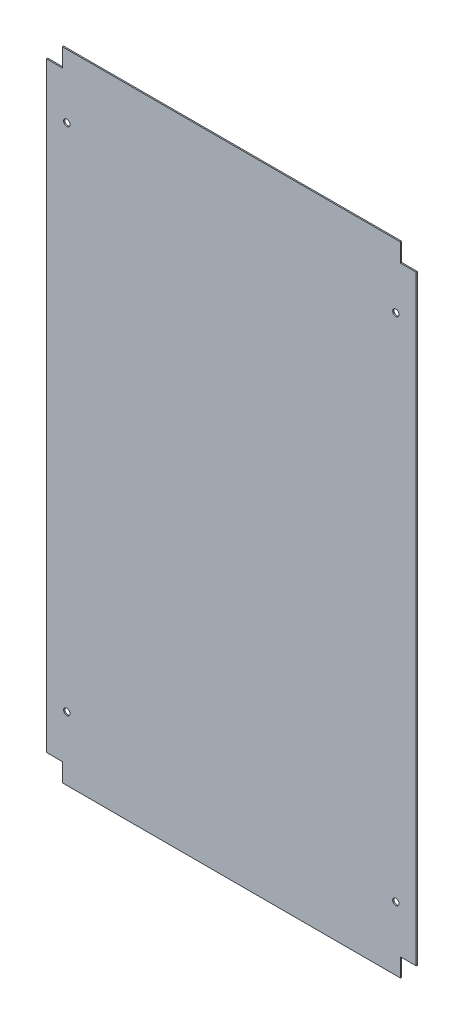
ISO-10303-21;
HEADER;
FILE_DESCRIPTION(('STEP AP214'),'2;1');
FILE_NAME('part.step','',(''),(''),'','','');
FILE_SCHEMA(('AUTOMOTIVE_DESIGN { 1 0 10303 214 1 1 1 1 }'));
ENDSEC;
DATA;
#1=APPLICATION_CONTEXT('core data for automotive mechanical design processes');
#2=APPLICATION_PROTOCOL_DEFINITION('international standard','automotive_design',2000,#1);
#3=PRODUCT_CONTEXT('',#1,'mechanical');
#4=PRODUCT('Part','Part','',(#3));
#5=PRODUCT_RELATED_PRODUCT_CATEGORY('part','',(#4));
#6=PRODUCT_DEFINITION_FORMATION('','',#4);
#7=PRODUCT_DEFINITION_CONTEXT('part definition',#1,'design');
#8=PRODUCT_DEFINITION('design','',#6,#7);
#9=PRODUCT_DEFINITION_SHAPE('','',#8);
#10=(LENGTH_UNIT() NAMED_UNIT(*) SI_UNIT(.MILLI.,.METRE.));
#11=(NAMED_UNIT(*) PLANE_ANGLE_UNIT() SI_UNIT($,.RADIAN.));
#12=(NAMED_UNIT(*) SI_UNIT($,.STERADIAN.) SOLID_ANGLE_UNIT());
#13=UNCERTAINTY_MEASURE_WITH_UNIT(LENGTH_MEASURE(1.E-05),#10,'distance_accuracy_value','');
#14=(GEOMETRIC_REPRESENTATION_CONTEXT(3) GLOBAL_UNCERTAINTY_ASSIGNED_CONTEXT((#13)) GLOBAL_UNIT_ASSIGNED_CONTEXT((#10,
#11,#12)) REPRESENTATION_CONTEXT('',''));
#15=CARTESIAN_POINT('',(0.,0.,0.));
#16=DIRECTION('',(0.,0.,1.));
#17=DIRECTION('',(1.,0.,0.));
#18=AXIS2_PLACEMENT_3D('',#15,#16,#17);
#19=CARTESIAN_POINT('',(0.,0.,-1.524));
#20=DIRECTION('',(0.,0.,-1.));
#21=DIRECTION('',(-1.,0.,0.));
#22=AXIS2_PLACEMENT_3D('',#19,#20,#21);
#23=PLANE('',#22);
#24=CARTESIAN_POINT('',(204.724,317.5,-1.524));
#25=DIRECTION('',(0.,0.,-1.));
#26=DIRECTION('',(-1.,0.,0.));
#27=AXIS2_PLACEMENT_3D('',#24,#25,#26);
#28=CIRCLE('',#27,3.9624);
#29=CARTESIAN_POINT('',(200.7616,317.5,-1.524));
#30=VERTEX_POINT('',#29);
#31=EDGE_CURVE('E383',#30,#30,#28,.T.);
#32=ORIENTED_EDGE('',*,*,#31,.F.);
#33=EDGE_LOOP('',(#32));
#34=FACE_BOUND('',#33,.T.);
#35=CARTESIAN_POINT('',(-204.851,-317.5,-1.524));
#36=DIRECTION('',(0.,0.,-1.));
#37=DIRECTION('',(-1.,0.,0.));
#38=AXIS2_PLACEMENT_3D('',#35,#36,#37);
#39=CIRCLE('',#38,3.9624);
#40=CARTESIAN_POINT('',(-208.8134,-317.5,-1.524));
#41=VERTEX_POINT('',#40);
#42=EDGE_CURVE('E379',#41,#41,#39,.T.);
#43=ORIENTED_EDGE('',*,*,#42,.F.);
#44=EDGE_LOOP('',(#43));
#45=FACE_BOUND('',#44,.T.);
#46=CARTESIAN_POINT('',(204.724,-317.5,-1.524));
#47=DIRECTION('',(0.,0.,-1.));
#48=DIRECTION('',(-1.,0.,0.));
#49=AXIS2_PLACEMENT_3D('',#46,#47,#48);
#50=CIRCLE('',#49,3.9624);
#51=CARTESIAN_POINT('',(200.7616,-317.5,-1.524));
#52=VERTEX_POINT('',#51);
#53=EDGE_CURVE('E375',#52,#52,#50,.T.);
#54=ORIENTED_EDGE('',*,*,#53,.F.);
#55=EDGE_LOOP('',(#54));
#56=FACE_BOUND('',#55,.T.);
#57=CARTESIAN_POINT('',(-204.851,317.5,-1.524));
#58=DIRECTION('',(0.,0.,-1.));
#59=DIRECTION('',(-1.,0.,0.));
#60=AXIS2_PLACEMENT_3D('',#57,#58,#59);
#61=CIRCLE('',#60,3.9624);
#62=CARTESIAN_POINT('',(-208.8134,317.5,-1.524));
#63=VERTEX_POINT('',#62);
#64=EDGE_CURVE('E371',#63,#63,#61,.T.);
#65=ORIENTED_EDGE('',*,*,#64,.F.);
#66=EDGE_LOOP('',(#65));
#67=FACE_BOUND('',#66,.T.);
#68=DIRECTION('',(0.,-1.,0.));
#69=VECTOR('',#68,1.);
#70=CARTESIAN_POINT('',(210.3628,-380.238,-1.524));
#71=LINE('',#70,#69);
#72=CARTESIAN_POINT('',(210.3628,-374.0404,-1.524));
#73=VERTEX_POINT('',#72);
#74=CARTESIAN_POINT('',(210.3628,-396.734962531012,-1.52399999999991));
#75=VERTEX_POINT('',#74);
#76=EDGE_CURVE('E462',#73,#75,#71,.T.);
#77=ORIENTED_EDGE('',*,*,#76,.T.);
#78=DIRECTION('',(-1.,0.,0.));
#79=VECTOR('',#78,1.);
#80=CARTESIAN_POINT('',(210.3628,-396.734962531012,-1.52399999999991));
#81=LINE('',#80,#79);
#82=CARTESIAN_POINT('',(-210.3628,-396.734962531012,-1.52399999999991));
#83=VERTEX_POINT('',#82);
#84=EDGE_CURVE('E328',#83,#75,#81,.F.);
#85=ORIENTED_EDGE('',*,*,#84,.F.);
#86=DIRECTION('',(0.,1.,0.));
#87=VECTOR('',#86,1.);
#88=CARTESIAN_POINT('',(-210.3628,-380.238,-1.524));
#89=LINE('',#88,#87);
#90=CARTESIAN_POINT('',(-210.3628,-374.0404,-1.524));
#91=VERTEX_POINT('',#90);
#92=EDGE_CURVE('E478',#83,#91,#89,.T.);
#93=ORIENTED_EDGE('',*,*,#92,.T.);
#94=DIRECTION('',(-1.,0.,0.));
#95=VECTOR('',#94,1.);
#96=CARTESIAN_POINT('',(-210.2866,-374.0404,-1.52400000000004));
#97=LINE('',#96,#95);
#98=CARTESIAN_POINT('',(-210.2866,-374.0404,-1.524));
#99=VERTEX_POINT('',#98);
#100=EDGE_CURVE('E401',#99,#91,#97,.T.);
#101=ORIENTED_EDGE('',*,*,#100,.F.);
#102=DIRECTION('',(0.,-1.,0.));
#103=VECTOR('',#102,1.);
#104=CARTESIAN_POINT('',(-210.2866,-373.888,-1.52400000000004));
#105=LINE('',#104,#103);
#106=CARTESIAN_POINT('',(-210.2866,-373.888,-1.524));
#107=VERTEX_POINT('',#106);
#108=EDGE_CURVE('E395',#107,#99,#105,.T.);
#109=ORIENTED_EDGE('',*,*,#108,.F.);
#110=DIRECTION('',(-1.,0.,0.));
#111=VECTOR('',#110,1.);
#112=CARTESIAN_POINT('',(-213.487,-373.888,-1.524));
#113=LINE('',#112,#111);
#114=CARTESIAN_POINT('',(-229.983962531013,-373.888,-1.52399999999989));
#115=VERTEX_POINT('',#114);
#116=EDGE_CURVE('E481',#107,#115,#113,.T.);
#117=ORIENTED_EDGE('',*,*,#116,.T.);
#118=DIRECTION('',(0.,1.,0.));
#119=VECTOR('',#118,1.);
#120=CARTESIAN_POINT('',(-229.983962531013,-373.888,-1.52399999999989));
#121=LINE('',#120,#119);
#122=CARTESIAN_POINT('',(-229.983962531013,373.888,-1.5239999999998));
#123=VERTEX_POINT('',#122);
#124=EDGE_CURVE('E311',#123,#115,#121,.F.);
#125=ORIENTED_EDGE('',*,*,#124,.F.);
#126=DIRECTION('',(1.,0.,0.));
#127=VECTOR('',#126,1.);
#128=CARTESIAN_POINT('',(-213.487,373.888,-1.524));
#129=LINE('',#128,#127);
#130=CARTESIAN_POINT('',(-210.2866,373.888,-1.524));
#131=VERTEX_POINT('',#130);
#132=EDGE_CURVE('E158',#123,#131,#129,.T.);
#133=ORIENTED_EDGE('',*,*,#132,.T.);
#134=DIRECTION('',(0.,-1.,0.));
#135=VECTOR('',#134,1.);
#136=CARTESIAN_POINT('',(-210.2866,374.0404,-1.52400000000004));
#137=LINE('',#136,#135);
#138=CARTESIAN_POINT('',(-210.2866,374.0404,-1.524));
#139=VERTEX_POINT('',#138);
#140=EDGE_CURVE('E153',#139,#131,#137,.T.);
#141=ORIENTED_EDGE('',*,*,#140,.F.);
#142=DIRECTION('',(1.,0.,0.));
#143=VECTOR('',#142,1.);
#144=CARTESIAN_POINT('',(-213.487,374.0404,-1.52400000000004));
#145=LINE('',#144,#143);
#146=CARTESIAN_POINT('',(-210.3628,374.0404,-1.524));
#147=VERTEX_POINT('',#146);
#148=EDGE_CURVE('E388',#147,#139,#145,.T.);
#149=ORIENTED_EDGE('',*,*,#148,.F.);
#150=DIRECTION('',(0.,1.,0.));
#151=VECTOR('',#150,1.);
#152=CARTESIAN_POINT('',(-210.3628,380.238,-1.524));
#153=LINE('',#152,#151);
#154=CARTESIAN_POINT('',(-210.3628,396.734962531012,-1.52399999999986));
#155=VERTEX_POINT('',#154);
#156=EDGE_CURVE('E290',#147,#155,#153,.T.);
#157=ORIENTED_EDGE('',*,*,#156,.T.);
#158=DIRECTION('',(1.,0.,0.));
#159=VECTOR('',#158,1.);
#160=CARTESIAN_POINT('',(-210.3628,396.734962531012,-1.52399999999986));
#161=LINE('',#160,#159);
#162=CARTESIAN_POINT('',(210.3628,396.734962531012,-1.52399999999986));
#163=VERTEX_POINT('',#162);
#164=EDGE_CURVE('E288',#163,#155,#161,.F.);
#165=ORIENTED_EDGE('',*,*,#164,.F.);
#166=DIRECTION('',(0.,-1.,0.));
#167=VECTOR('',#166,1.);
#168=CARTESIAN_POINT('',(210.3628,380.238,-1.524));
#169=LINE('',#168,#167);
#170=CARTESIAN_POINT('',(210.3628,374.0404,-1.52400000000006));
#171=VERTEX_POINT('',#170);
#172=EDGE_CURVE('E275',#163,#171,#169,.T.);
#173=ORIENTED_EDGE('',*,*,#172,.T.);
#174=DIRECTION('',(1.,0.,0.));
#175=VECTOR('',#174,1.);
#176=CARTESIAN_POINT('',(210.2866,374.0404,-1.52400000000006));
#177=LINE('',#176,#175);
#178=CARTESIAN_POINT('',(210.2866,374.0404,-1.52400000000006));
#179=VERTEX_POINT('',#178);
#180=EDGE_CURVE('E441',#179,#171,#177,.T.);
#181=ORIENTED_EDGE('',*,*,#180,.F.);
#182=DIRECTION('',(0.,1.,0.));
#183=VECTOR('',#182,1.);
#184=CARTESIAN_POINT('',(210.2866,373.888,-1.52400000000006));
#185=LINE('',#184,#183);
#186=CARTESIAN_POINT('',(210.2866,373.888,-1.52400000000006));
#187=VERTEX_POINT('',#186);
#188=EDGE_CURVE('E435',#187,#179,#185,.T.);
#189=ORIENTED_EDGE('',*,*,#188,.F.);
#190=DIRECTION('',(1.,0.,0.));
#191=VECTOR('',#190,1.);
#192=CARTESIAN_POINT('',(213.487,373.888,-1.524));
#193=LINE('',#192,#191);
#194=CARTESIAN_POINT('',(229.983962531012,373.888,-1.52399999999986));
#195=VERTEX_POINT('',#194);
#196=EDGE_CURVE('E284',#187,#195,#193,.T.);
#197=ORIENTED_EDGE('',*,*,#196,.T.);
#198=DIRECTION('',(0.,-1.,0.));
#199=VECTOR('',#198,1.);
#200=CARTESIAN_POINT('',(229.983962531012,373.888,-1.52399999999986));
#201=LINE('',#200,#199);
#202=CARTESIAN_POINT('',(229.983962531012,-373.888,-1.52399999999978));
#203=VERTEX_POINT('',#202);
#204=EDGE_CURVE('E320',#203,#195,#201,.F.);
#205=ORIENTED_EDGE('',*,*,#204,.F.);
#206=DIRECTION('',(-1.,0.,0.));
#207=VECTOR('',#206,1.);
#208=CARTESIAN_POINT('',(213.487,-373.888,-1.524));
#209=LINE('',#208,#207);
#210=CARTESIAN_POINT('',(210.2866,-373.888,-1.524));
#211=VERTEX_POINT('',#210);
#212=EDGE_CURVE('E490',#203,#211,#209,.T.);
#213=ORIENTED_EDGE('',*,*,#212,.T.);
#214=DIRECTION('',(0.,1.,0.));
#215=VECTOR('',#214,1.);
#216=CARTESIAN_POINT('',(210.2866,-374.0404,-1.52400000000006));
#217=LINE('',#216,#215);
#218=CARTESIAN_POINT('',(210.2866,-374.0404,-1.524));
#219=VERTEX_POINT('',#218);
#220=EDGE_CURVE('E430',#219,#211,#217,.T.);
#221=ORIENTED_EDGE('',*,*,#220,.F.);
#222=DIRECTION('',(-1.,0.,0.));
#223=VECTOR('',#222,1.);
#224=CARTESIAN_POINT('',(213.487,-374.0404,-1.52400000000006));
#225=LINE('',#224,#223);
#226=EDGE_CURVE('E425',#73,#219,#225,.T.);
#227=ORIENTED_EDGE('',*,*,#226,.F.);
#228=EDGE_LOOP('',(#77,#85,#93,#101,#109,#117,#125,#133,#141,#149,#157,#165,#173,#181,#189,#197,
#205,#213,#221,#227));
#229=FACE_BOUND('',#228,.T.);
#230=ADVANCED_FACE('F137',(#34,#45,#56,#67,#229),#23,.T.);
#231=CARTESIAN_POINT('',(0.,0.,0.));
#232=DIRECTION('',(0.,0.,-1.));
#233=DIRECTION('',(-1.,0.,0.));
#234=AXIS2_PLACEMENT_3D('',#231,#232,#233);
#235=PLANE('',#234);
#236=CARTESIAN_POINT('',(204.724,317.5,0.));
#237=DIRECTION('',(0.,0.,1.));
#238=DIRECTION('',(1.,0.,0.));
#239=AXIS2_PLACEMENT_3D('',#236,#237,#238);
#240=CIRCLE('',#239,3.9624);
#241=CARTESIAN_POINT('',(208.6864,317.5,0.));
#242=VERTEX_POINT('',#241);
#243=EDGE_CURVE('E360',#242,#242,#240,.T.);
#244=ORIENTED_EDGE('',*,*,#243,.F.);
#245=EDGE_LOOP('',(#244));
#246=FACE_BOUND('',#245,.T.);
#247=CARTESIAN_POINT('',(-204.851,-317.5,0.));
#248=DIRECTION('',(0.,0.,1.));
#249=DIRECTION('',(1.,0.,0.));
#250=AXIS2_PLACEMENT_3D('',#247,#248,#249);
#251=CIRCLE('',#250,3.9624);
#252=CARTESIAN_POINT('',(-200.8886,-317.5,0.));
#253=VERTEX_POINT('',#252);
#254=EDGE_CURVE('E359',#253,#253,#251,.T.);
#255=ORIENTED_EDGE('',*,*,#254,.F.);
#256=EDGE_LOOP('',(#255));
#257=FACE_BOUND('',#256,.T.);
#258=CARTESIAN_POINT('',(204.724,-317.5,0.));
#259=DIRECTION('',(0.,0.,1.));
#260=DIRECTION('',(1.,0.,0.));
#261=AXIS2_PLACEMENT_3D('',#258,#259,#260);
#262=CIRCLE('',#261,3.9624);
#263=CARTESIAN_POINT('',(208.6864,-317.5,0.));
#264=VERTEX_POINT('',#263);
#265=EDGE_CURVE('E344',#264,#264,#262,.T.);
#266=ORIENTED_EDGE('',*,*,#265,.F.);
#267=EDGE_LOOP('',(#266));
#268=FACE_BOUND('',#267,.T.);
#269=CARTESIAN_POINT('',(-204.851,317.5,0.));
#270=DIRECTION('',(0.,0.,1.));
#271=DIRECTION('',(1.,0.,0.));
#272=AXIS2_PLACEMENT_3D('',#269,#270,#271);
#273=CIRCLE('',#272,3.9624);
#274=CARTESIAN_POINT('',(-200.8886,317.5,0.));
#275=VERTEX_POINT('',#274);
#276=EDGE_CURVE('E364',#275,#275,#273,.T.);
#277=ORIENTED_EDGE('',*,*,#276,.F.);
#278=EDGE_LOOP('',(#277));
#279=FACE_BOUND('',#278,.T.);
#280=DIRECTION('',(0.,1.,0.));
#281=VECTOR('',#280,1.);
#282=CARTESIAN_POINT('',(-210.3628,-380.238,0.));
#283=LINE('',#282,#281);
#284=CARTESIAN_POINT('',(-210.3628,-396.734962531012,1.11022302462516E-13));
#285=VERTEX_POINT('',#284);
#286=CARTESIAN_POINT('',(-210.3628,-374.0404,0.));
#287=VERTEX_POINT('',#286);
#288=EDGE_CURVE('E472',#285,#287,#283,.T.);
#289=ORIENTED_EDGE('',*,*,#288,.F.);
#290=DIRECTION('',(1.,0.,0.));
#291=VECTOR('',#290,1.);
#292=CARTESIAN_POINT('',(0.,-396.734962531012,1.11022302462516E-13));
#293=LINE('',#292,#291);
#294=CARTESIAN_POINT('',(210.3628,-396.734962531012,1.11022302462516E-13));
#295=VERTEX_POINT('',#294);
#296=EDGE_CURVE('E340',#285,#295,#293,.T.);
#297=ORIENTED_EDGE('',*,*,#296,.T.);
#298=DIRECTION('',(0.,-1.,0.));
#299=VECTOR('',#298,1.);
#300=CARTESIAN_POINT('',(210.3628,-380.238,0.));
#301=LINE('',#300,#299);
#302=CARTESIAN_POINT('',(210.3628,-374.0404,0.));
#303=VERTEX_POINT('',#302);
#304=EDGE_CURVE('E487',#303,#295,#301,.T.);
#305=ORIENTED_EDGE('',*,*,#304,.F.);
#306=DIRECTION('',(1.,0.,0.));
#307=VECTOR('',#306,1.);
#308=CARTESIAN_POINT('',(0.,-374.0404,0.));
#309=LINE('',#308,#307);
#310=CARTESIAN_POINT('',(210.2866,-374.0404,0.));
#311=VERTEX_POINT('',#310);
#312=EDGE_CURVE('E429',#311,#303,#309,.T.);
#313=ORIENTED_EDGE('',*,*,#312,.F.);
#314=DIRECTION('',(0.,-1.,0.));
#315=VECTOR('',#314,1.);
#316=CARTESIAN_POINT('',(210.2866,0.,0.));
#317=LINE('',#316,#315);
#318=CARTESIAN_POINT('',(210.2866,-373.888,0.));
#319=VERTEX_POINT('',#318);
#320=EDGE_CURVE('E513',#319,#311,#317,.T.);
#321=ORIENTED_EDGE('',*,*,#320,.F.);
#322=DIRECTION('',(-1.,0.,0.));
#323=VECTOR('',#322,1.);
#324=CARTESIAN_POINT('',(213.487,-373.888,0.));
#325=LINE('',#324,#323);
#326=CARTESIAN_POINT('',(229.983962531012,-373.888,1.94289029309402E-13));
#327=VERTEX_POINT('',#326);
#328=EDGE_CURVE('E484',#327,#319,#325,.T.);
#329=ORIENTED_EDGE('',*,*,#328,.F.);
#330=DIRECTION('',(0.,1.,0.));
#331=VECTOR('',#330,1.);
#332=CARTESIAN_POINT('',(229.983962531012,0.,1.66533453693773E-13));
#333=LINE('',#332,#331);
#334=CARTESIAN_POINT('',(229.983962531012,373.888,1.11022302462516E-13));
#335=VERTEX_POINT('',#334);
#336=EDGE_CURVE('E307',#327,#335,#333,.T.);
#337=ORIENTED_EDGE('',*,*,#336,.T.);
#338=DIRECTION('',(1.,0.,0.));
#339=VECTOR('',#338,1.);
#340=CARTESIAN_POINT('',(213.487,373.888,0.));
#341=LINE('',#340,#339);
#342=CARTESIAN_POINT('',(210.2866,373.888,0.));
#343=VERTEX_POINT('',#342);
#344=EDGE_CURVE('E285',#343,#335,#341,.T.);
#345=ORIENTED_EDGE('',*,*,#344,.F.);
#346=DIRECTION('',(0.,-1.,0.));
#347=VECTOR('',#346,1.);
#348=CARTESIAN_POINT('',(210.2866,0.,0.));
#349=LINE('',#348,#347);
#350=CARTESIAN_POINT('',(210.2866,374.0404,0.));
#351=VERTEX_POINT('',#350);
#352=EDGE_CURVE('E509',#351,#343,#349,.T.);
#353=ORIENTED_EDGE('',*,*,#352,.F.);
#354=DIRECTION('',(-1.,0.,0.));
#355=VECTOR('',#354,1.);
#356=CARTESIAN_POINT('',(0.,374.0404,0.));
#357=LINE('',#356,#355);
#358=CARTESIAN_POINT('',(210.3628,374.0404,0.));
#359=VERTEX_POINT('',#358);
#360=EDGE_CURVE('E459',#359,#351,#357,.T.);
#361=ORIENTED_EDGE('',*,*,#360,.F.);
#362=DIRECTION('',(0.,-1.,0.));
#363=VECTOR('',#362,1.);
#364=CARTESIAN_POINT('',(210.3628,380.238,0.));
#365=LINE('',#364,#363);
#366=CARTESIAN_POINT('',(210.3628,396.734962531012,1.66533453693773E-13));
#367=VERTEX_POINT('',#366);
#368=EDGE_CURVE('E469',#367,#359,#365,.T.);
#369=ORIENTED_EDGE('',*,*,#368,.F.);
#370=DIRECTION('',(-1.,0.,0.));
#371=VECTOR('',#370,1.);
#372=CARTESIAN_POINT('',(0.,396.734962531012,1.66533453693773E-13));
#373=LINE('',#372,#371);
#374=CARTESIAN_POINT('',(-210.3628,396.734962531012,1.66533453693773E-13));
#375=VERTEX_POINT('',#374);
#376=EDGE_CURVE('E299',#367,#375,#373,.T.);
#377=ORIENTED_EDGE('',*,*,#376,.T.);
#378=DIRECTION('',(0.,1.,0.));
#379=VECTOR('',#378,1.);
#380=CARTESIAN_POINT('',(-210.3628,380.238,0.));
#381=LINE('',#380,#379);
#382=CARTESIAN_POINT('',(-210.3628,374.0404,0.));
#383=VERTEX_POINT('',#382);
#384=EDGE_CURVE('E463',#383,#375,#381,.T.);
#385=ORIENTED_EDGE('',*,*,#384,.F.);
#386=DIRECTION('',(-1.,0.,0.));
#387=VECTOR('',#386,1.);
#388=CARTESIAN_POINT('',(0.,374.0404,0.));
#389=LINE('',#388,#387);
#390=CARTESIAN_POINT('',(-210.2866,374.0404,0.));
#391=VERTEX_POINT('',#390);
#392=EDGE_CURVE('E420',#391,#383,#389,.T.);
#393=ORIENTED_EDGE('',*,*,#392,.F.);
#394=DIRECTION('',(0.,1.,0.));
#395=VECTOR('',#394,1.);
#396=CARTESIAN_POINT('',(-210.2866,0.,0.));
#397=LINE('',#396,#395);
#398=CARTESIAN_POINT('',(-210.2866,373.888,0.));
#399=VERTEX_POINT('',#398);
#400=EDGE_CURVE('E13',#399,#391,#397,.T.);
#401=ORIENTED_EDGE('',*,*,#400,.F.);
#402=DIRECTION('',(1.,0.,0.));
#403=VECTOR('',#402,1.);
#404=CARTESIAN_POINT('',(-213.487,373.888,0.));
#405=LINE('',#404,#403);
#406=CARTESIAN_POINT('',(-229.983962531013,373.888,1.66533453693773E-13));
#407=VERTEX_POINT('',#406);
#408=EDGE_CURVE('E466',#407,#399,#405,.T.);
#409=ORIENTED_EDGE('',*,*,#408,.F.);
#410=DIRECTION('',(0.,-1.,0.));
#411=VECTOR('',#410,1.);
#412=CARTESIAN_POINT('',(-229.983962531013,0.,1.38777878078145E-13));
#413=LINE('',#412,#411);
#414=CARTESIAN_POINT('',(-229.983962531013,-373.888,1.11022302462516E-13));
#415=VERTEX_POINT('',#414);
#416=EDGE_CURVE('E324',#407,#415,#413,.T.);
#417=ORIENTED_EDGE('',*,*,#416,.T.);
#418=DIRECTION('',(-1.,0.,0.));
#419=VECTOR('',#418,1.);
#420=CARTESIAN_POINT('',(-213.487,-373.888,0.));
#421=LINE('',#420,#419);
#422=CARTESIAN_POINT('',(-210.2866,-373.888,0.));
#423=VERTEX_POINT('',#422);
#424=EDGE_CURVE('E475',#423,#415,#421,.T.);
#425=ORIENTED_EDGE('',*,*,#424,.F.);
#426=DIRECTION('',(0.,1.,0.));
#427=VECTOR('',#426,1.);
#428=CARTESIAN_POINT('',(-210.2866,0.,0.));
#429=LINE('',#428,#427);
#430=CARTESIAN_POINT('',(-210.2866,-374.0404,0.));
#431=VERTEX_POINT('',#430);
#432=EDGE_CURVE('E146',#431,#423,#429,.T.);
#433=ORIENTED_EDGE('',*,*,#432,.F.);
#434=DIRECTION('',(1.,0.,0.));
#435=VECTOR('',#434,1.);
#436=CARTESIAN_POINT('',(0.,-374.0404,0.));
#437=LINE('',#436,#435);
#438=EDGE_CURVE('E391',#287,#431,#437,.T.);
#439=ORIENTED_EDGE('',*,*,#438,.F.);
#440=EDGE_LOOP('',(#289,#297,#305,#313,#321,#329,#337,#345,#353,#361,#369,#377,#385,#393,#401,
#409,#417,#425,#433,#439));
#441=FACE_BOUND('',#440,.T.);
#442=ADVANCED_FACE('F139',(#246,#257,#268,#279,#441),#235,.F.);
#443=CARTESIAN_POINT('',(-210.3628,-380.238,-1.524));
#444=DIRECTION('',(1.,0.,0.));
#445=DIRECTION('',(0.,0.,-1.));
#446=AXIS2_PLACEMENT_3D('',#443,#444,#445);
#447=PLANE('',#446);
#448=ORIENTED_EDGE('',*,*,#92,.F.);
#449=DIRECTION('',(0.,0.,-1.));
#450=VECTOR('',#449,1.);
#451=CARTESIAN_POINT('',(-210.3628,-396.734962531012,1.11022302462516E-13));
#452=LINE('',#451,#450);
#453=EDGE_CURVE('E349',#285,#83,#452,.T.);
#454=ORIENTED_EDGE('',*,*,#453,.F.);
#455=ORIENTED_EDGE('',*,*,#288,.T.);
#456=DIRECTION('',(0.,0.,1.));
#457=VECTOR('',#456,1.);
#458=CARTESIAN_POINT('',(-210.3628,-374.0404,-1.524));
#459=LINE('',#458,#457);
#460=EDGE_CURVE('E517',#91,#287,#459,.T.);
#461=ORIENTED_EDGE('',*,*,#460,.F.);
#462=EDGE_LOOP('',(#448,#454,#455,#461));
#463=FACE_BOUND('',#462,.T.);
#464=ADVANCED_FACE('F547',(#463),#447,.F.);
#465=CARTESIAN_POINT('',(210.3628,-380.238,-1.524));
#466=DIRECTION('',(-1.,0.,0.));
#467=DIRECTION('',(0.,-1.,0.));
#468=AXIS2_PLACEMENT_3D('',#465,#466,#467);
#469=PLANE('',#468);
#470=ORIENTED_EDGE('',*,*,#304,.T.);
#471=DIRECTION('',(0.,0.,-1.));
#472=VECTOR('',#471,1.);
#473=CARTESIAN_POINT('',(210.3628,-396.734962531012,1.11022302462516E-13));
#474=LINE('',#473,#472);
#475=EDGE_CURVE('E345',#295,#75,#474,.T.);
#476=ORIENTED_EDGE('',*,*,#475,.T.);
#477=ORIENTED_EDGE('',*,*,#76,.F.);
#478=DIRECTION('',(0.,0.,-1.));
#479=VECTOR('',#478,1.);
#480=CARTESIAN_POINT('',(210.3628,-374.0404,-1.524));
#481=LINE('',#480,#479);
#482=EDGE_CURVE('E499',#303,#73,#481,.T.);
#483=ORIENTED_EDGE('',*,*,#482,.F.);
#484=EDGE_LOOP('',(#470,#476,#477,#483));
#485=FACE_BOUND('',#484,.T.);
#486=ADVANCED_FACE('F550',(#485),#469,.F.);
#487=CARTESIAN_POINT('',(-210.3628,380.238,-1.524));
#488=DIRECTION('',(1.,0.,0.));
#489=DIRECTION('',(0.,0.,-1.));
#490=AXIS2_PLACEMENT_3D('',#487,#488,#489);
#491=PLANE('',#490);
#492=DIRECTION('',(0.,0.,-1.));
#493=VECTOR('',#492,1.);
#494=CARTESIAN_POINT('',(-210.3628,374.0404,-1.524));
#495=LINE('',#494,#493);
#496=EDGE_CURVE('E521',#383,#147,#495,.T.);
#497=ORIENTED_EDGE('',*,*,#496,.F.);
#498=ORIENTED_EDGE('',*,*,#384,.T.);
#499=DIRECTION('',(0.,0.,-1.));
#500=VECTOR('',#499,1.);
#501=CARTESIAN_POINT('',(-210.3628,396.734962531012,1.11022302462516E-13));
#502=LINE('',#501,#500);
#503=EDGE_CURVE('E301',#375,#155,#502,.T.);
#504=ORIENTED_EDGE('',*,*,#503,.T.);
#505=ORIENTED_EDGE('',*,*,#156,.F.);
#506=EDGE_LOOP('',(#497,#498,#504,#505));
#507=FACE_BOUND('',#506,.T.);
#508=ADVANCED_FACE('F579',(#507),#491,.F.);
#509=CARTESIAN_POINT('',(-213.487,373.888,-1.524));
#510=DIRECTION('',(0.,-1.,0.));
#511=DIRECTION('',(1.,0.,0.));
#512=AXIS2_PLACEMENT_3D('',#509,#510,#511);
#513=PLANE('',#512);
#514=ORIENTED_EDGE('',*,*,#132,.F.);
#515=DIRECTION('',(0.,0.,-1.));
#516=VECTOR('',#515,1.);
#517=CARTESIAN_POINT('',(-229.983962531013,373.888,1.94289029309402E-13));
#518=LINE('',#517,#516);
#519=EDGE_CURVE('E333',#407,#123,#518,.T.);
#520=ORIENTED_EDGE('',*,*,#519,.F.);
#521=ORIENTED_EDGE('',*,*,#408,.T.);
#522=DIRECTION('',(0.,0.,1.));
#523=VECTOR('',#522,1.);
#524=CARTESIAN_POINT('',(-210.2866,373.888,-1.52400000000004));
#525=LINE('',#524,#523);
#526=EDGE_CURVE('E399',#131,#399,#525,.T.);
#527=ORIENTED_EDGE('',*,*,#526,.F.);
#528=EDGE_LOOP('',(#514,#520,#521,#527));
#529=FACE_BOUND('',#528,.T.);
#530=ADVANCED_FACE('F587',(#529),#513,.F.);
#531=CARTESIAN_POINT('',(-213.487,-373.888,-1.524));
#532=DIRECTION('',(0.,1.,0.));
#533=DIRECTION('',(-1.,0.,0.));
#534=AXIS2_PLACEMENT_3D('',#531,#532,#533);
#535=PLANE('',#534);
#536=ORIENTED_EDGE('',*,*,#424,.T.);
#537=DIRECTION('',(0.,0.,-1.));
#538=VECTOR('',#537,1.);
#539=CARTESIAN_POINT('',(-229.983962531013,-373.888,1.11022302462516E-13));
#540=LINE('',#539,#538);
#541=EDGE_CURVE('E329',#415,#115,#540,.T.);
#542=ORIENTED_EDGE('',*,*,#541,.T.);
#543=ORIENTED_EDGE('',*,*,#116,.F.);
#544=DIRECTION('',(0.,0.,1.));
#545=VECTOR('',#544,1.);
#546=CARTESIAN_POINT('',(-210.2866,-373.888,-1.52400000000004));
#547=LINE('',#546,#545);
#548=EDGE_CURVE('E400',#107,#423,#547,.T.);
#549=ORIENTED_EDGE('',*,*,#548,.T.);
#550=EDGE_LOOP('',(#536,#542,#543,#549));
#551=FACE_BOUND('',#550,.T.);
#552=ADVANCED_FACE('F533',(#551),#535,.F.);
#553=CARTESIAN_POINT('',(210.3628,380.238,-1.524));
#554=DIRECTION('',(-1.,0.,0.));
#555=DIRECTION('',(0.,0.,1.));
#556=AXIS2_PLACEMENT_3D('',#553,#554,#555);
#557=PLANE('',#556);
#558=DIRECTION('',(0.,0.,1.));
#559=VECTOR('',#558,1.);
#560=CARTESIAN_POINT('',(210.3628,374.0404,-1.524));
#561=LINE('',#560,#559);
#562=EDGE_CURVE('E281',#171,#359,#561,.T.);
#563=ORIENTED_EDGE('',*,*,#562,.F.);
#564=ORIENTED_EDGE('',*,*,#172,.F.);
#565=DIRECTION('',(0.,0.,-1.));
#566=VECTOR('',#565,1.);
#567=CARTESIAN_POINT('',(210.3628,396.734962531012,1.66533453693773E-13));
#568=LINE('',#567,#566);
#569=EDGE_CURVE('E280',#367,#163,#568,.T.);
#570=ORIENTED_EDGE('',*,*,#569,.F.);
#571=ORIENTED_EDGE('',*,*,#368,.T.);
#572=EDGE_LOOP('',(#563,#564,#570,#571));
#573=FACE_BOUND('',#572,.T.);
#574=ADVANCED_FACE('F277',(#573),#557,.F.);
#575=CARTESIAN_POINT('',(213.487,373.888,-1.524));
#576=DIRECTION('',(0.,-1.,0.));
#577=DIRECTION('',(1.,0.,0.));
#578=AXIS2_PLACEMENT_3D('',#575,#576,#577);
#579=PLANE('',#578);
#580=ORIENTED_EDGE('',*,*,#344,.T.);
#581=DIRECTION('',(0.,0.,-1.));
#582=VECTOR('',#581,1.);
#583=CARTESIAN_POINT('',(229.983962531012,373.888,0.));
#584=LINE('',#583,#582);
#585=EDGE_CURVE('E312',#335,#195,#584,.T.);
#586=ORIENTED_EDGE('',*,*,#585,.T.);
#587=ORIENTED_EDGE('',*,*,#196,.F.);
#588=DIRECTION('',(0.,0.,1.));
#589=VECTOR('',#588,1.);
#590=CARTESIAN_POINT('',(210.2866,373.888,-1.52400000000006));
#591=LINE('',#590,#589);
#592=EDGE_CURVE('E440',#187,#343,#591,.T.);
#593=ORIENTED_EDGE('',*,*,#592,.T.);
#594=EDGE_LOOP('',(#580,#586,#587,#593));
#595=FACE_BOUND('',#594,.T.);
#596=ADVANCED_FACE('F568',(#595),#579,.F.);
#597=CARTESIAN_POINT('',(213.487,-373.888,-1.524));
#598=DIRECTION('',(0.,1.,0.));
#599=DIRECTION('',(-1.,0.,0.));
#600=AXIS2_PLACEMENT_3D('',#597,#598,#599);
#601=PLANE('',#600);
#602=ORIENTED_EDGE('',*,*,#212,.F.);
#603=DIRECTION('',(0.,0.,-1.));
#604=VECTOR('',#603,1.);
#605=CARTESIAN_POINT('',(229.983962531012,-373.888,1.94289029309402E-13));
#606=LINE('',#605,#604);
#607=EDGE_CURVE('E316',#327,#203,#606,.T.);
#608=ORIENTED_EDGE('',*,*,#607,.F.);
#609=ORIENTED_EDGE('',*,*,#328,.T.);
#610=DIRECTION('',(0.,0.,1.));
#611=VECTOR('',#610,1.);
#612=CARTESIAN_POINT('',(210.2866,-373.888,-1.52400000000006));
#613=LINE('',#612,#611);
#614=EDGE_CURVE('E439',#211,#319,#613,.T.);
#615=ORIENTED_EDGE('',*,*,#614,.F.);
#616=EDGE_LOOP('',(#602,#608,#609,#615));
#617=FACE_BOUND('',#616,.T.);
#618=ADVANCED_FACE('F564',(#617),#601,.F.);
#619=CARTESIAN_POINT('',(213.487,-374.0404,-1.52400000000006));
#620=DIRECTION('',(0.,1.,0.));
#621=DIRECTION('',(0.,0.,1.));
#622=AXIS2_PLACEMENT_3D('',#619,#620,#621);
#623=PLANE('',#622);
#624=DIRECTION('',(0.,0.,1.));
#625=VECTOR('',#624,1.);
#626=CARTESIAN_POINT('',(210.2866,-374.0404,-1.52400000000006));
#627=LINE('',#626,#625);
#628=EDGE_CURVE('E434',#219,#311,#627,.T.);
#629=ORIENTED_EDGE('',*,*,#628,.T.);
#630=ORIENTED_EDGE('',*,*,#312,.T.);
#631=ORIENTED_EDGE('',*,*,#482,.T.);
#632=ORIENTED_EDGE('',*,*,#226,.T.);
#633=EDGE_LOOP('',(#629,#630,#631,#632));
#634=FACE_BOUND('',#633,.T.);
#635=ADVANCED_FACE('F553',(#634),#623,.T.);
#636=CARTESIAN_POINT('',(210.2866,-374.0404,-1.52400000000006));
#637=DIRECTION('',(1.,0.,0.));
#638=DIRECTION('',(0.,0.,-1.));
#639=AXIS2_PLACEMENT_3D('',#636,#637,#638);
#640=PLANE('',#639);
#641=ORIENTED_EDGE('',*,*,#614,.T.);
#642=ORIENTED_EDGE('',*,*,#320,.T.);
#643=ORIENTED_EDGE('',*,*,#628,.F.);
#644=ORIENTED_EDGE('',*,*,#220,.T.);
#645=EDGE_LOOP('',(#641,#642,#643,#644));
#646=FACE_BOUND('',#645,.T.);
#647=ADVANCED_FACE('F556',(#646),#640,.T.);
#648=CARTESIAN_POINT('',(210.2866,373.888,-1.52400000000006));
#649=DIRECTION('',(1.,0.,0.));
#650=DIRECTION('',(0.,0.,-1.));
#651=AXIS2_PLACEMENT_3D('',#648,#649,#650);
#652=PLANE('',#651);
#653=DIRECTION('',(0.,0.,1.));
#654=VECTOR('',#653,1.);
#655=CARTESIAN_POINT('',(210.2866,374.0404,-1.52400000000006));
#656=LINE('',#655,#654);
#657=EDGE_CURVE('E424',#179,#351,#656,.T.);
#658=ORIENTED_EDGE('',*,*,#657,.T.);
#659=ORIENTED_EDGE('',*,*,#352,.T.);
#660=ORIENTED_EDGE('',*,*,#592,.F.);
#661=ORIENTED_EDGE('',*,*,#188,.T.);
#662=EDGE_LOOP('',(#658,#659,#660,#661));
#663=FACE_BOUND('',#662,.T.);
#664=ADVANCED_FACE('F573',(#663),#652,.T.);
#665=CARTESIAN_POINT('',(210.2866,374.0404,-1.52400000000006));
#666=DIRECTION('',(0.,-1.,0.));
#667=DIRECTION('',(0.,0.,-1.));
#668=AXIS2_PLACEMENT_3D('',#665,#666,#667);
#669=PLANE('',#668);
#670=ORIENTED_EDGE('',*,*,#562,.T.);
#671=ORIENTED_EDGE('',*,*,#360,.T.);
#672=ORIENTED_EDGE('',*,*,#657,.F.);
#673=ORIENTED_EDGE('',*,*,#180,.T.);
#674=EDGE_LOOP('',(#670,#671,#672,#673));
#675=FACE_BOUND('',#674,.T.);
#676=ADVANCED_FACE('F575',(#675),#669,.T.);
#677=CARTESIAN_POINT('',(-210.2866,-374.0404,-1.52400000000004));
#678=DIRECTION('',(0.,1.,0.));
#679=DIRECTION('',(0.,0.,1.));
#680=AXIS2_PLACEMENT_3D('',#677,#678,#679);
#681=PLANE('',#680);
#682=ORIENTED_EDGE('',*,*,#460,.T.);
#683=ORIENTED_EDGE('',*,*,#438,.T.);
#684=DIRECTION('',(0.,0.,1.));
#685=VECTOR('',#684,1.);
#686=CARTESIAN_POINT('',(-210.2866,-374.0404,-1.52400000000004));
#687=LINE('',#686,#685);
#688=EDGE_CURVE('E387',#99,#431,#687,.T.);
#689=ORIENTED_EDGE('',*,*,#688,.F.);
#690=ORIENTED_EDGE('',*,*,#100,.T.);
#691=EDGE_LOOP('',(#682,#683,#689,#690));
#692=FACE_BOUND('',#691,.T.);
#693=ADVANCED_FACE('F539',(#692),#681,.T.);
#694=CARTESIAN_POINT('',(-210.2866,-373.888,-1.52400000000004));
#695=DIRECTION('',(-1.,0.,0.));
#696=DIRECTION('',(0.,0.,1.));
#697=AXIS2_PLACEMENT_3D('',#694,#695,#696);
#698=PLANE('',#697);
#699=ORIENTED_EDGE('',*,*,#688,.T.);
#700=ORIENTED_EDGE('',*,*,#432,.T.);
#701=ORIENTED_EDGE('',*,*,#548,.F.);
#702=ORIENTED_EDGE('',*,*,#108,.T.);
#703=EDGE_LOOP('',(#699,#700,#701,#702));
#704=FACE_BOUND('',#703,.T.);
#705=ADVANCED_FACE('F528',(#704),#698,.T.);
#706=CARTESIAN_POINT('',(-210.2866,374.0404,-1.52400000000004));
#707=DIRECTION('',(-1.,0.,0.));
#708=DIRECTION('',(0.,0.,1.));
#709=AXIS2_PLACEMENT_3D('',#706,#707,#708);
#710=PLANE('',#709);
#711=ORIENTED_EDGE('',*,*,#526,.T.);
#712=ORIENTED_EDGE('',*,*,#400,.T.);
#713=DIRECTION('',(0.,0.,1.));
#714=VECTOR('',#713,1.);
#715=CARTESIAN_POINT('',(-210.2866,374.0404,-1.52400000000004));
#716=LINE('',#715,#714);
#717=EDGE_CURVE('E394',#139,#391,#716,.T.);
#718=ORIENTED_EDGE('',*,*,#717,.F.);
#719=ORIENTED_EDGE('',*,*,#140,.T.);
#720=EDGE_LOOP('',(#711,#712,#718,#719));
#721=FACE_BOUND('',#720,.T.);
#722=ADVANCED_FACE('F585',(#721),#710,.T.);
#723=CARTESIAN_POINT('',(-213.487,374.0404,-1.52400000000004));
#724=DIRECTION('',(0.,-1.,0.));
#725=DIRECTION('',(0.,0.,-1.));
#726=AXIS2_PLACEMENT_3D('',#723,#724,#725);
#727=PLANE('',#726);
#728=ORIENTED_EDGE('',*,*,#717,.T.);
#729=ORIENTED_EDGE('',*,*,#392,.T.);
#730=ORIENTED_EDGE('',*,*,#496,.T.);
#731=ORIENTED_EDGE('',*,*,#148,.T.);
#732=EDGE_LOOP('',(#728,#729,#730,#731));
#733=FACE_BOUND('',#732,.T.);
#734=ADVANCED_FACE('F581',(#733),#727,.T.);
#735=CARTESIAN_POINT('',(-204.851,317.5,-19.05));
#736=DIRECTION('',(0.,0.,1.));
#737=DIRECTION('',(1.,0.,0.));
#738=AXIS2_PLACEMENT_3D('',#735,#736,#737);
#739=CYLINDRICAL_SURFACE('',#738,3.9624);
#740=ORIENTED_EDGE('',*,*,#64,.T.);
#741=EDGE_LOOP('',(#740));
#742=FACE_BOUND('',#741,.T.);
#743=ORIENTED_EDGE('',*,*,#276,.T.);
#744=EDGE_LOOP('',(#743));
#745=FACE_BOUND('',#744,.T.);
#746=ADVANCED_FACE('F636',(#742,#745),#739,.F.);
#747=CARTESIAN_POINT('',(204.724,-317.5,-19.05));
#748=DIRECTION('',(0.,0.,1.));
#749=DIRECTION('',(1.,0.,0.));
#750=AXIS2_PLACEMENT_3D('',#747,#748,#749);
#751=CYLINDRICAL_SURFACE('',#750,3.9624);
#752=ORIENTED_EDGE('',*,*,#53,.T.);
#753=EDGE_LOOP('',(#752));
#754=FACE_BOUND('',#753,.T.);
#755=ORIENTED_EDGE('',*,*,#265,.T.);
#756=EDGE_LOOP('',(#755));
#757=FACE_BOUND('',#756,.T.);
#758=ADVANCED_FACE('F645',(#754,#757),#751,.F.);
#759=CARTESIAN_POINT('',(-204.851,-317.5,-19.05));
#760=DIRECTION('',(0.,0.,1.));
#761=DIRECTION('',(1.,0.,0.));
#762=AXIS2_PLACEMENT_3D('',#759,#760,#761);
#763=CYLINDRICAL_SURFACE('',#762,3.9624);
#764=ORIENTED_EDGE('',*,*,#42,.T.);
#765=EDGE_LOOP('',(#764));
#766=FACE_BOUND('',#765,.T.);
#767=ORIENTED_EDGE('',*,*,#254,.T.);
#768=EDGE_LOOP('',(#767));
#769=FACE_BOUND('',#768,.T.);
#770=ADVANCED_FACE('F647',(#766,#769),#763,.F.);
#771=CARTESIAN_POINT('',(204.724,317.5,-19.05));
#772=DIRECTION('',(0.,0.,1.));
#773=DIRECTION('',(1.,0.,0.));
#774=AXIS2_PLACEMENT_3D('',#771,#772,#773);
#775=CYLINDRICAL_SURFACE('',#774,3.9624);
#776=ORIENTED_EDGE('',*,*,#31,.T.);
#777=EDGE_LOOP('',(#776));
#778=FACE_BOUND('',#777,.T.);
#779=ORIENTED_EDGE('',*,*,#243,.T.);
#780=EDGE_LOOP('',(#779));
#781=FACE_BOUND('',#780,.T.);
#782=ADVANCED_FACE('F599',(#778,#781),#775,.F.);
#783=CARTESIAN_POINT('',(210.3628,-396.734962531012,1.11022302462516E-13));
#784=DIRECTION('',(0.,1.,0.));
#785=DIRECTION('',(0.,0.,1.));
#786=AXIS2_PLACEMENT_3D('',#783,#784,#785);
#787=PLANE('',#786);
#788=ORIENTED_EDGE('',*,*,#84,.T.);
#789=ORIENTED_EDGE('',*,*,#475,.F.);
#790=ORIENTED_EDGE('',*,*,#296,.F.);
#791=ORIENTED_EDGE('',*,*,#453,.T.);
#792=EDGE_LOOP('',(#788,#789,#790,#791));
#793=FACE_BOUND('',#792,.T.);
#794=ADVANCED_FACE('F546',(#793),#787,.F.);
#795=CARTESIAN_POINT('',(-229.983962531013,-373.888,1.11022302462516E-13));
#796=DIRECTION('',(1.,0.,0.));
#797=DIRECTION('',(0.,0.,-1.));
#798=AXIS2_PLACEMENT_3D('',#795,#796,#797);
#799=PLANE('',#798);
#800=ORIENTED_EDGE('',*,*,#124,.T.);
#801=ORIENTED_EDGE('',*,*,#541,.F.);
#802=ORIENTED_EDGE('',*,*,#416,.F.);
#803=ORIENTED_EDGE('',*,*,#519,.T.);
#804=EDGE_LOOP('',(#800,#801,#802,#803));
#805=FACE_BOUND('',#804,.T.);
#806=ADVANCED_FACE('F591',(#805),#799,.F.);
#807=CARTESIAN_POINT('',(229.983962531012,373.888,1.11022302462516E-13));
#808=DIRECTION('',(-1.,0.,0.));
#809=DIRECTION('',(0.,0.,1.));
#810=AXIS2_PLACEMENT_3D('',#807,#808,#809);
#811=PLANE('',#810);
#812=ORIENTED_EDGE('',*,*,#204,.T.);
#813=ORIENTED_EDGE('',*,*,#585,.F.);
#814=ORIENTED_EDGE('',*,*,#336,.F.);
#815=ORIENTED_EDGE('',*,*,#607,.T.);
#816=EDGE_LOOP('',(#812,#813,#814,#815));
#817=FACE_BOUND('',#816,.T.);
#818=ADVANCED_FACE('F563',(#817),#811,.F.);
#819=CARTESIAN_POINT('',(-210.3628,396.734962531012,1.11022302462516E-13));
#820=DIRECTION('',(0.,-1.,0.));
#821=DIRECTION('',(0.,0.,-1.));
#822=AXIS2_PLACEMENT_3D('',#819,#820,#821);
#823=PLANE('',#822);
#824=ORIENTED_EDGE('',*,*,#164,.T.);
#825=ORIENTED_EDGE('',*,*,#503,.F.);
#826=ORIENTED_EDGE('',*,*,#376,.F.);
#827=ORIENTED_EDGE('',*,*,#569,.T.);
#828=EDGE_LOOP('',(#824,#825,#826,#827));
#829=FACE_BOUND('',#828,.T.);
#830=ADVANCED_FACE('F297',(#829),#823,.F.);
#831=CLOSED_SHELL('',(#230,#442,#464,#486,#508,#530,#552,#574,#596,#618,#635,#647,#664,#676,
#693,#705,#722,#734,#746,#758,#770,#782,#794,#806,#818,#830));
#832=MANIFOLD_SOLID_BREP('B2',#831);
#833=ADVANCED_BREP_SHAPE_REPRESENTATION('',(#18,#832),#14);
#834=SHAPE_DEFINITION_REPRESENTATION(#9,#833);
ENDSEC;
END-ISO-10303-21;
